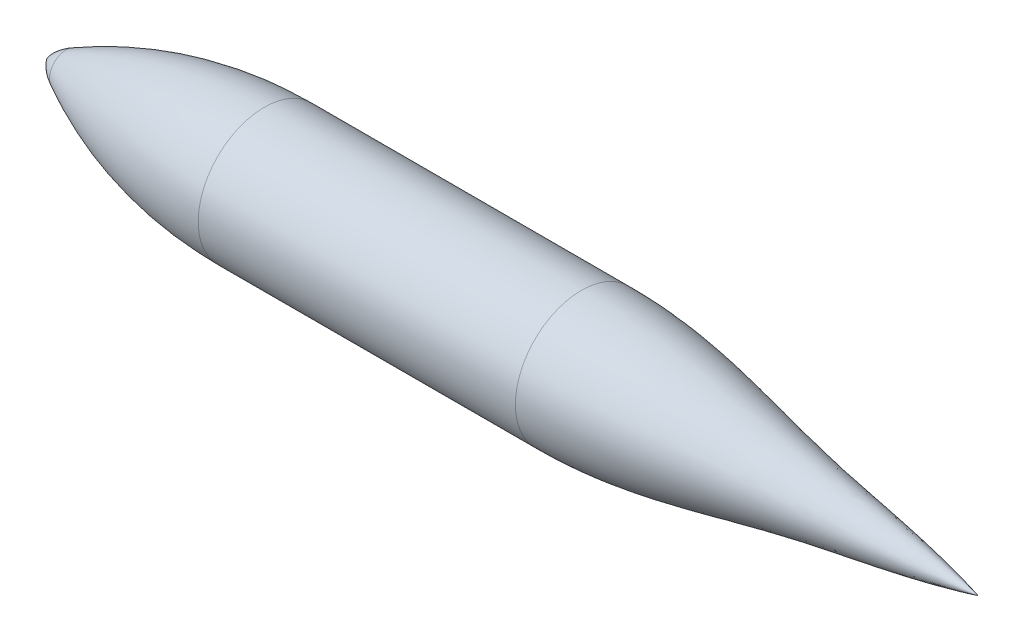
ISO-10303-21;
HEADER;
FILE_DESCRIPTION(('STEP AP214'),'2;1');
FILE_NAME('part.step','',(''),(''),'','','');
FILE_SCHEMA(('AUTOMOTIVE_DESIGN { 1 0 10303 214 1 1 1 1 }'));
ENDSEC;
DATA;
#1=APPLICATION_CONTEXT('core data for automotive mechanical design processes');
#2=APPLICATION_PROTOCOL_DEFINITION('international standard','automotive_design',2000,#1);
#3=PRODUCT_CONTEXT('',#1,'mechanical');
#4=PRODUCT('Part','Part','',(#3));
#5=PRODUCT_RELATED_PRODUCT_CATEGORY('part','',(#4));
#6=PRODUCT_DEFINITION_FORMATION('','',#4);
#7=PRODUCT_DEFINITION_CONTEXT('part definition',#1,'design');
#8=PRODUCT_DEFINITION('design','',#6,#7);
#9=PRODUCT_DEFINITION_SHAPE('','',#8);
#10=(LENGTH_UNIT() NAMED_UNIT(*) SI_UNIT(.MILLI.,.METRE.));
#11=(NAMED_UNIT(*) PLANE_ANGLE_UNIT() SI_UNIT($,.RADIAN.));
#12=(NAMED_UNIT(*) SI_UNIT($,.STERADIAN.) SOLID_ANGLE_UNIT());
#13=UNCERTAINTY_MEASURE_WITH_UNIT(LENGTH_MEASURE(1.E-05),#10,'distance_accuracy_value','');
#14=(GEOMETRIC_REPRESENTATION_CONTEXT(3) GLOBAL_UNCERTAINTY_ASSIGNED_CONTEXT((#13)) GLOBAL_UNIT_ASSIGNED_CONTEXT((#10,
#11,#12)) REPRESENTATION_CONTEXT('',''));
#15=CARTESIAN_POINT('',(0.,0.,0.));
#16=DIRECTION('',(0.,0.,1.));
#17=DIRECTION('',(1.,0.,0.));
#18=AXIS2_PLACEMENT_3D('',#15,#16,#17);
#19=CARTESIAN_POINT('',(-173.8,0.,28.97));
#20=CARTESIAN_POINT('',(-154.274057960004,0.,28.97));
#21=CARTESIAN_POINT('',(-123.601815915925,0.,24.7789597044732));
#22=CARTESIAN_POINT('',(-65.5245143266319,0.,11.0778751633801));
#23=CARTESIAN_POINT('',(-25.1896816177886,0.,6.75163002593633));
#24=CARTESIAN_POINT('',(0.,0.,0.));
#25=B_SPLINE_CURVE_WITH_KNOTS('',3,(#19,#20,#21,#22,#23,#24),.UNSPECIFIED.,.F.,.F.,(4,1,1,4),
(0.,0.305180337866786,0.55947683465441,1.),.UNSPECIFIED.);
#26=CARTESIAN_POINT('',(0.,0.,0.));
#27=DIRECTION('',(1.,0.,0.));
#28=AXIS1_PLACEMENT('',#26,#27);
#29=SURFACE_OF_REVOLUTION('',#25,#28);
#30=CARTESIAN_POINT('',(0.,0.,0.));
#31=VERTEX_POINT('',#30);
#32=VERTEX_LOOP('',#31);
#33=FACE_BOUND('',#32,.T.);
#34=CARTESIAN_POINT('',(-173.8,0.,0.));
#35=DIRECTION('',(1.,0.,0.));
#36=DIRECTION('',(0.,0.,-1.));
#37=AXIS2_PLACEMENT_3D('',#34,#35,#36);
#38=CIRCLE('',#37,28.97);
#39=CARTESIAN_POINT('',(-173.8,0.,-28.97));
#40=VERTEX_POINT('',#39);
#41=EDGE_CURVE('E65',#40,#40,#38,.T.);
#42=ORIENTED_EDGE('',*,*,#41,.T.);
#43=EDGE_LOOP('',(#42));
#44=FACE_BOUND('',#43,.T.);
#45=ADVANCED_FACE('F43',(#33,#44),#29,.T.);
#46=CARTESIAN_POINT('',(-407.984249418414,0.,0.));
#47=CARTESIAN_POINT('',(-404.778087213305,0.,4.68473583082531));
#48=CARTESIAN_POINT('',(-399.7,0.,7.24));
#49=B_SPLINE_CURVE_WITH_KNOTS('',2,(#46,#47,#48),.UNSPECIFIED.,.F.,.F.,(3,3),(0.,1.),.UNSPECIFIED.);
#50=CARTESIAN_POINT('',(0.,0.,0.));
#51=DIRECTION('',(1.,0.,0.));
#52=AXIS1_PLACEMENT('',#50,#51);
#53=SURFACE_OF_REVOLUTION('',#49,#52);
#54=CARTESIAN_POINT('',(-399.7,0.,0.));
#55=DIRECTION('',(1.,0.,0.));
#56=DIRECTION('',(0.,0.,-1.));
#57=AXIS2_PLACEMENT_3D('',#54,#55,#56);
#58=CIRCLE('',#57,7.24);
#59=CARTESIAN_POINT('',(-399.7,0.,-7.24));
#60=VERTEX_POINT('',#59);
#61=EDGE_CURVE('E11',#60,#60,#58,.T.);
#62=ORIENTED_EDGE('',*,*,#61,.F.);
#63=EDGE_LOOP('',(#62));
#64=FACE_BOUND('',#63,.T.);
#65=CARTESIAN_POINT('',(-407.984249418414,0.,0.));
#66=VERTEX_POINT('',#65);
#67=VERTEX_LOOP('',#66);
#68=FACE_BOUND('',#67,.T.);
#69=ADVANCED_FACE('F56',(#64,#68),#53,.T.);
#70=CARTESIAN_POINT('',(-399.7,0.,7.24));
#71=CARTESIAN_POINT('',(-358.928969373865,0.,28.7786385748551));
#72=CARTESIAN_POINT('',(-312.8,0.,28.97));
#73=B_SPLINE_CURVE_WITH_KNOTS('',2,(#70,#71,#72),.UNSPECIFIED.,.F.,.F.,(3,3),(0.,1.),.UNSPECIFIED.);
#74=CARTESIAN_POINT('',(0.,0.,0.));
#75=DIRECTION('',(1.,0.,0.));
#76=AXIS1_PLACEMENT('',#74,#75);
#77=SURFACE_OF_REVOLUTION('',#73,#76);
#78=CARTESIAN_POINT('',(-312.8,0.,0.));
#79=DIRECTION('',(1.,0.,0.));
#80=DIRECTION('',(0.,0.,-1.));
#81=AXIS2_PLACEMENT_3D('',#78,#79,#80);
#82=CIRCLE('',#81,28.97);
#83=CARTESIAN_POINT('',(-312.8,0.,-28.97));
#84=VERTEX_POINT('',#83);
#85=EDGE_CURVE('E51',#84,#84,#82,.T.);
#86=ORIENTED_EDGE('',*,*,#85,.F.);
#87=EDGE_LOOP('',(#86));
#88=FACE_BOUND('',#87,.T.);
#89=ORIENTED_EDGE('',*,*,#61,.T.);
#90=EDGE_LOOP('',(#89));
#91=FACE_BOUND('',#90,.T.);
#92=ADVANCED_FACE('F79',(#88,#91),#77,.T.);
#93=CARTESIAN_POINT('',(0.,0.,0.));
#94=DIRECTION('',(1.,0.,0.));
#95=DIRECTION('',(0.,0.,-1.));
#96=AXIS2_PLACEMENT_3D('',#93,#94,#95);
#97=CYLINDRICAL_SURFACE('',#96,28.97);
#98=ORIENTED_EDGE('',*,*,#41,.F.);
#99=EDGE_LOOP('',(#98));
#100=FACE_BOUND('',#99,.T.);
#101=ORIENTED_EDGE('',*,*,#85,.T.);
#102=EDGE_LOOP('',(#101));
#103=FACE_BOUND('',#102,.T.);
#104=ADVANCED_FACE('F84',(#100,#103),#97,.T.);
#105=CLOSED_SHELL('',(#45,#69,#92,#104));
#106=MANIFOLD_SOLID_BREP('B2',#105);
#107=ADVANCED_BREP_SHAPE_REPRESENTATION('',(#18,#106),#14);
#108=SHAPE_DEFINITION_REPRESENTATION(#9,#107);
ENDSEC;
END-ISO-10303-21;
